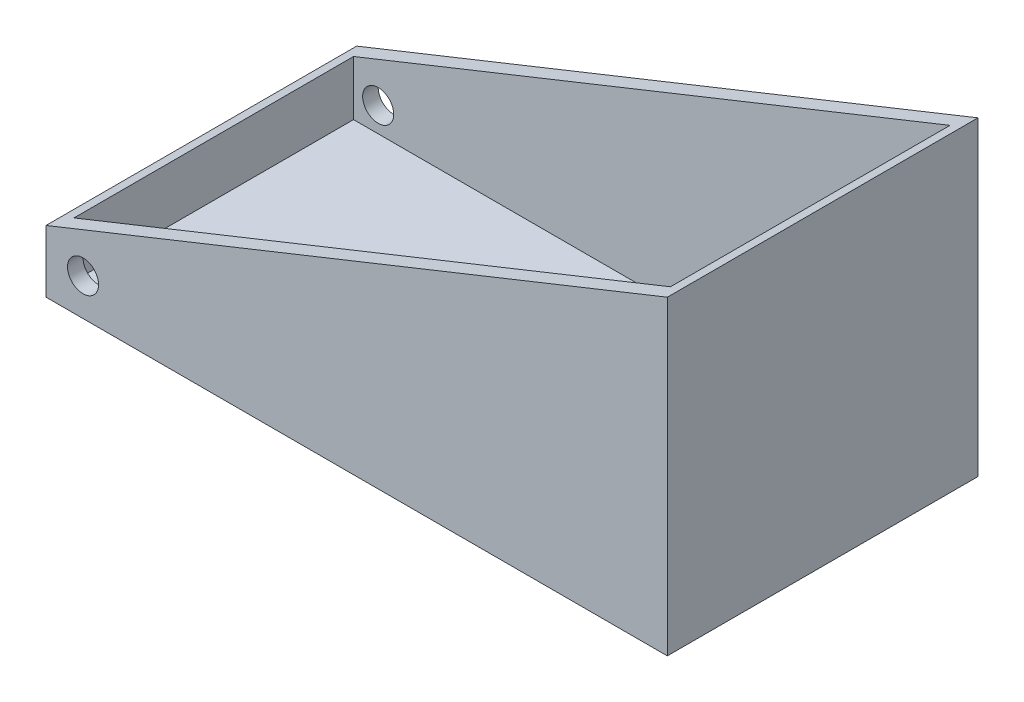
ISO-10303-21;
HEADER;
FILE_DESCRIPTION(('STEP AP214'),'2;1');
FILE_NAME('part.step','',(''),(''),'','','');
FILE_SCHEMA(('AUTOMOTIVE_DESIGN { 1 0 10303 214 1 1 1 1 }'));
ENDSEC;
DATA;
#1=APPLICATION_CONTEXT('core data for automotive mechanical design processes');
#2=APPLICATION_PROTOCOL_DEFINITION('international standard','automotive_design',2000,#1);
#3=PRODUCT_CONTEXT('',#1,'mechanical');
#4=PRODUCT('Part','Part','',(#3));
#5=PRODUCT_RELATED_PRODUCT_CATEGORY('part','',(#4));
#6=PRODUCT_DEFINITION_FORMATION('','',#4);
#7=PRODUCT_DEFINITION_CONTEXT('part definition',#1,'design');
#8=PRODUCT_DEFINITION('design','',#6,#7);
#9=PRODUCT_DEFINITION_SHAPE('','',#8);
#10=(LENGTH_UNIT() NAMED_UNIT(*) SI_UNIT(.MILLI.,.METRE.));
#11=(NAMED_UNIT(*) PLANE_ANGLE_UNIT() SI_UNIT($,.RADIAN.));
#12=(NAMED_UNIT(*) SI_UNIT($,.STERADIAN.) SOLID_ANGLE_UNIT());
#13=UNCERTAINTY_MEASURE_WITH_UNIT(LENGTH_MEASURE(1.E-05),#10,'distance_accuracy_value','');
#14=(GEOMETRIC_REPRESENTATION_CONTEXT(3) GLOBAL_UNCERTAINTY_ASSIGNED_CONTEXT((#13)) GLOBAL_UNIT_ASSIGNED_CONTEXT((#10,
#11,#12)) REPRESENTATION_CONTEXT('',''));
#15=CARTESIAN_POINT('',(0.,0.,0.));
#16=DIRECTION('',(0.,0.,1.));
#17=DIRECTION('',(1.,0.,0.));
#18=AXIS2_PLACEMENT_3D('',#15,#16,#17);
#19=CARTESIAN_POINT('',(100.,-2.4131274131274,50.));
#20=DIRECTION('',(0.,1.,0.));
#21=DIRECTION('',(-1.,0.,0.));
#22=AXIS2_PLACEMENT_3D('',#19,#20,#21);
#23=PLANE('',#22);
#24=DIRECTION('',(1.,0.,0.));
#25=VECTOR('',#24,1.);
#26=CARTESIAN_POINT('',(100.,-2.4131274131274,0.));
#27=LINE('',#26,#25);
#28=CARTESIAN_POINT('',(0.,-2.41312741312741,0.));
#29=VERTEX_POINT('',#28);
#30=CARTESIAN_POINT('',(100.,-2.4131274131274,0.));
#31=VERTEX_POINT('',#30);
#32=EDGE_CURVE('E147',#29,#31,#27,.T.);
#33=ORIENTED_EDGE('',*,*,#32,.T.);
#34=DIRECTION('',(0.,0.,-1.));
#35=VECTOR('',#34,1.);
#36=CARTESIAN_POINT('',(100.,-2.4131274131274,50.));
#37=LINE('',#36,#35);
#38=CARTESIAN_POINT('',(100.,-2.4131274131274,50.));
#39=VERTEX_POINT('',#38);
#40=EDGE_CURVE('E167',#39,#31,#37,.T.);
#41=ORIENTED_EDGE('',*,*,#40,.F.);
#42=DIRECTION('',(1.,0.,0.));
#43=VECTOR('',#42,1.);
#44=CARTESIAN_POINT('',(100.,-2.4131274131274,50.));
#45=LINE('',#44,#43);
#46=CARTESIAN_POINT('',(0.,-2.41312741312741,50.));
#47=VERTEX_POINT('',#46);
#48=EDGE_CURVE('E95',#47,#39,#45,.T.);
#49=ORIENTED_EDGE('',*,*,#48,.F.);
#50=DIRECTION('',(0.,0.,-1.));
#51=VECTOR('',#50,1.);
#52=CARTESIAN_POINT('',(0.,-2.41312741312741,50.));
#53=LINE('',#52,#51);
#54=EDGE_CURVE('E170',#47,#29,#53,.T.);
#55=ORIENTED_EDGE('',*,*,#54,.T.);
#56=EDGE_LOOP('',(#33,#41,#49,#55));
#57=FACE_BOUND('',#56,.T.);
#58=ADVANCED_FACE('F41',(#57),#23,.F.);
#59=CARTESIAN_POINT('',(100.,47.5868725868726,50.));
#60=DIRECTION('',(-1.,0.,0.));
#61=DIRECTION('',(0.,-1.,0.));
#62=AXIS2_PLACEMENT_3D('',#59,#60,#61);
#63=PLANE('',#62);
#64=DIRECTION('',(0.,1.,0.));
#65=VECTOR('',#64,1.);
#66=CARTESIAN_POINT('',(100.,47.5868725868726,0.));
#67=LINE('',#66,#65);
#68=CARTESIAN_POINT('',(100.,47.5868725868726,0.));
#69=VERTEX_POINT('',#68);
#70=EDGE_CURVE('E160',#31,#69,#67,.T.);
#71=ORIENTED_EDGE('',*,*,#70,.T.);
#72=DIRECTION('',(0.,0.,-1.));
#73=VECTOR('',#72,1.);
#74=CARTESIAN_POINT('',(100.,47.5868725868726,50.));
#75=LINE('',#74,#73);
#76=CARTESIAN_POINT('',(100.,47.5868725868726,50.));
#77=VERTEX_POINT('',#76);
#78=EDGE_CURVE('E165',#77,#69,#75,.T.);
#79=ORIENTED_EDGE('',*,*,#78,.F.);
#80=DIRECTION('',(0.,1.,0.));
#81=VECTOR('',#80,1.);
#82=CARTESIAN_POINT('',(100.,47.5868725868726,50.));
#83=LINE('',#82,#81);
#84=EDGE_CURVE('E154',#39,#77,#83,.T.);
#85=ORIENTED_EDGE('',*,*,#84,.F.);
#86=ORIENTED_EDGE('',*,*,#40,.T.);
#87=EDGE_LOOP('',(#71,#79,#85,#86));
#88=FACE_BOUND('',#87,.T.);
#89=ADVANCED_FACE('F197',(#88),#63,.F.);
#90=CARTESIAN_POINT('',(0.,7.58687258687259,50.));
#91=DIRECTION('',(0.371390676354104,-0.928476690885259,0.));
#92=DIRECTION('',(0.928476690885259,0.371390676354104,0.));
#93=AXIS2_PLACEMENT_3D('',#90,#91,#92);
#94=PLANE('',#93);
#95=DIRECTION('',(0.,0.,1.));
#96=VECTOR('',#95,1.);
#97=CARTESIAN_POINT('',(98.,46.7868725868726,50.));
#98=LINE('',#97,#96);
#99=CARTESIAN_POINT('',(98.,46.7868725868726,2.5));
#100=VERTEX_POINT('',#99);
#101=CARTESIAN_POINT('',(98.,46.7868725868726,47.5));
#102=VERTEX_POINT('',#101);
#103=EDGE_CURVE('E49',#100,#102,#98,.T.);
#104=ORIENTED_EDGE('',*,*,#103,.T.);
#105=DIRECTION('',(-0.928476690885259,-0.371390676354104,0.));
#106=VECTOR('',#105,1.);
#107=CARTESIAN_POINT('',(0.,7.58687258687259,47.5));
#108=LINE('',#107,#106);
#109=CARTESIAN_POINT('',(2.,8.38687258687259,47.5));
#110=VERTEX_POINT('',#109);
#111=EDGE_CURVE('E11',#102,#110,#108,.T.);
#112=ORIENTED_EDGE('',*,*,#111,.T.);
#113=DIRECTION('',(0.,0.,-1.));
#114=VECTOR('',#113,1.);
#115=CARTESIAN_POINT('',(2.,8.38687258687259,50.));
#116=LINE('',#115,#114);
#117=CARTESIAN_POINT('',(2.,8.38687258687259,2.5));
#118=VERTEX_POINT('',#117);
#119=EDGE_CURVE('E120',#110,#118,#116,.T.);
#120=ORIENTED_EDGE('',*,*,#119,.T.);
#121=DIRECTION('',(0.928476690885259,0.371390676354104,0.));
#122=VECTOR('',#121,1.);
#123=CARTESIAN_POINT('',(0.,7.58687258687259,2.5));
#124=LINE('',#123,#122);
#125=EDGE_CURVE('E173',#118,#100,#124,.T.);
#126=ORIENTED_EDGE('',*,*,#125,.T.);
#127=EDGE_LOOP('',(#104,#112,#120,#126));
#128=FACE_BOUND('',#127,.T.);
#129=DIRECTION('',(-0.928476690885259,-0.371390676354104,0.));
#130=VECTOR('',#129,1.);
#131=CARTESIAN_POINT('',(0.,7.58687258687259,0.));
#132=LINE('',#131,#130);
#133=CARTESIAN_POINT('',(0.,7.58687258687259,0.));
#134=VERTEX_POINT('',#133);
#135=EDGE_CURVE('E88',#69,#134,#132,.T.);
#136=ORIENTED_EDGE('',*,*,#135,.T.);
#137=DIRECTION('',(0.,0.,-1.));
#138=VECTOR('',#137,1.);
#139=CARTESIAN_POINT('',(0.,7.58687258687259,50.));
#140=LINE('',#139,#138);
#141=CARTESIAN_POINT('',(0.,7.58687258687259,50.));
#142=VERTEX_POINT('',#141);
#143=EDGE_CURVE('E158',#142,#134,#140,.T.);
#144=ORIENTED_EDGE('',*,*,#143,.F.);
#145=DIRECTION('',(-0.928476690885259,-0.371390676354104,0.));
#146=VECTOR('',#145,1.);
#147=CARTESIAN_POINT('',(0.,7.58687258687259,50.));
#148=LINE('',#147,#146);
#149=EDGE_CURVE('E156',#77,#142,#148,.T.);
#150=ORIENTED_EDGE('',*,*,#149,.F.);
#151=ORIENTED_EDGE('',*,*,#78,.T.);
#152=EDGE_LOOP('',(#136,#144,#150,#151));
#153=FACE_BOUND('',#152,.T.);
#154=ADVANCED_FACE('F178',(#128,#153),#94,.F.);
#155=CARTESIAN_POINT('',(0.,0.25096525096525,50.));
#156=DIRECTION('',(1.,0.,0.));
#157=DIRECTION('',(0.,0.,-1.));
#158=AXIS2_PLACEMENT_3D('',#155,#156,#157);
#159=PLANE('',#158);
#160=DIRECTION('',(0.,-1.,0.));
#161=VECTOR('',#160,1.);
#162=CARTESIAN_POINT('',(0.,0.25096525096525,0.));
#163=LINE('',#162,#161);
#164=EDGE_CURVE('E152',#134,#29,#163,.T.);
#165=ORIENTED_EDGE('',*,*,#164,.T.);
#166=ORIENTED_EDGE('',*,*,#54,.F.);
#167=DIRECTION('',(0.,-1.,0.));
#168=VECTOR('',#167,1.);
#169=CARTESIAN_POINT('',(0.,-2.41312741312741,50.));
#170=LINE('',#169,#168);
#171=EDGE_CURVE('E65',#142,#47,#170,.T.);
#172=ORIENTED_EDGE('',*,*,#171,.F.);
#173=ORIENTED_EDGE('',*,*,#143,.T.);
#174=EDGE_LOOP('',(#165,#166,#172,#173));
#175=FACE_BOUND('',#174,.T.);
#176=ADVANCED_FACE('F209',(#175),#159,.F.);
#177=CARTESIAN_POINT('',(0.,0.,50.));
#178=DIRECTION('',(0.,0.,1.));
#179=DIRECTION('',(1.,0.,0.));
#180=AXIS2_PLACEMENT_3D('',#177,#178,#179);
#181=PLANE('',#180);
#182=CARTESIAN_POINT('',(5.96291201783626,3.54978460470885,50.));
#183=DIRECTION('',(0.,0.,-1.));
#184=DIRECTION('',(-1.,0.,0.));
#185=AXIS2_PLACEMENT_3D('',#182,#183,#184);
#186=CIRCLE('',#185,2.5);
#187=CARTESIAN_POINT('',(3.46291201783626,3.54978460470885,50.));
#188=VERTEX_POINT('',#187);
#189=EDGE_CURVE('E275',#188,#188,#186,.T.);
#190=ORIENTED_EDGE('',*,*,#189,.T.);
#191=EDGE_LOOP('',(#190));
#192=FACE_BOUND('',#191,.T.);
#193=ORIENTED_EDGE('',*,*,#171,.T.);
#194=ORIENTED_EDGE('',*,*,#48,.T.);
#195=ORIENTED_EDGE('',*,*,#84,.T.);
#196=ORIENTED_EDGE('',*,*,#149,.T.);
#197=EDGE_LOOP('',(#193,#194,#195,#196));
#198=FACE_BOUND('',#197,.T.);
#199=ADVANCED_FACE('F212',(#192,#198),#181,.T.);
#200=CARTESIAN_POINT('',(0.,0.,0.));
#201=DIRECTION('',(0.,0.,1.));
#202=DIRECTION('',(1.,0.,0.));
#203=AXIS2_PLACEMENT_3D('',#200,#201,#202);
#204=PLANE('',#203);
#205=CARTESIAN_POINT('',(5.96291201783626,3.54978460470885,0.));
#206=DIRECTION('',(0.,0.,-1.));
#207=DIRECTION('',(-1.,0.,0.));
#208=AXIS2_PLACEMENT_3D('',#205,#206,#207);
#209=CIRCLE('',#208,2.5);
#210=CARTESIAN_POINT('',(3.46291201783626,3.54978460470885,0.));
#211=VERTEX_POINT('',#210);
#212=EDGE_CURVE('E315',#211,#211,#209,.T.);
#213=ORIENTED_EDGE('',*,*,#212,.F.);
#214=EDGE_LOOP('',(#213));
#215=FACE_BOUND('',#214,.T.);
#216=ORIENTED_EDGE('',*,*,#32,.F.);
#217=ORIENTED_EDGE('',*,*,#164,.F.);
#218=ORIENTED_EDGE('',*,*,#135,.F.);
#219=ORIENTED_EDGE('',*,*,#70,.F.);
#220=EDGE_LOOP('',(#216,#217,#218,#219));
#221=FACE_BOUND('',#220,.T.);
#222=ADVANCED_FACE('F208',(#215,#221),#204,.F.);
#223=CARTESIAN_POINT('',(1.99999999999999,47.5868725868726,47.5));
#224=DIRECTION('',(0.,0.,1.));
#225=DIRECTION('',(1.,0.,0.));
#226=AXIS2_PLACEMENT_3D('',#223,#224,#225);
#227=PLANE('',#226);
#228=CARTESIAN_POINT('',(5.96291201783626,3.54978460470885,47.5));
#229=DIRECTION('',(0.,0.,1.));
#230=DIRECTION('',(1.,0.,0.));
#231=AXIS2_PLACEMENT_3D('',#228,#229,#230);
#232=CIRCLE('',#231,2.5);
#233=CARTESIAN_POINT('',(8.46291201783626,3.54978460470885,47.5));
#234=VERTEX_POINT('',#233);
#235=EDGE_CURVE('E138',#234,#234,#232,.T.);
#236=ORIENTED_EDGE('',*,*,#235,.T.);
#237=EDGE_LOOP('',(#236));
#238=FACE_BOUND('',#237,.T.);
#239=DIRECTION('',(0.,-1.,0.));
#240=VECTOR('',#239,1.);
#241=CARTESIAN_POINT('',(98.,47.5868725868726,47.5));
#242=LINE('',#241,#240);
#243=CARTESIAN_POINT('',(98.,-0.4131274131274,47.5));
#244=VERTEX_POINT('',#243);
#245=EDGE_CURVE('E137',#102,#244,#242,.T.);
#246=ORIENTED_EDGE('',*,*,#245,.T.);
#247=DIRECTION('',(-1.,0.,0.));
#248=VECTOR('',#247,1.);
#249=CARTESIAN_POINT('',(2.,-0.413127413127412,47.5));
#250=LINE('',#249,#248);
#251=CARTESIAN_POINT('',(2.,-0.413127413127412,47.5));
#252=VERTEX_POINT('',#251);
#253=EDGE_CURVE('E130',#244,#252,#250,.T.);
#254=ORIENTED_EDGE('',*,*,#253,.T.);
#255=DIRECTION('',(0.,-1.,0.));
#256=VECTOR('',#255,1.);
#257=CARTESIAN_POINT('',(1.99999999999999,47.5868725868726,47.5));
#258=LINE('',#257,#256);
#259=EDGE_CURVE('E115',#110,#252,#258,.T.);
#260=ORIENTED_EDGE('',*,*,#259,.F.);
#261=ORIENTED_EDGE('',*,*,#111,.F.);
#262=EDGE_LOOP('',(#246,#254,#260,#261));
#263=FACE_BOUND('',#262,.T.);
#264=ADVANCED_FACE('F135',(#238,#263),#227,.F.);
#265=CARTESIAN_POINT('',(98.,47.5868725868726,47.5));
#266=DIRECTION('',(1.,0.,0.));
#267=DIRECTION('',(0.,0.,-1.));
#268=AXIS2_PLACEMENT_3D('',#265,#266,#267);
#269=PLANE('',#268);
#270=DIRECTION('',(0.,-1.,0.));
#271=VECTOR('',#270,1.);
#272=CARTESIAN_POINT('',(98.,47.5868725868726,2.5));
#273=LINE('',#272,#271);
#274=CARTESIAN_POINT('',(98.,-0.4131274131274,2.5));
#275=VERTEX_POINT('',#274);
#276=EDGE_CURVE('E148',#100,#275,#273,.T.);
#277=ORIENTED_EDGE('',*,*,#276,.T.);
#278=DIRECTION('',(0.,0.,1.));
#279=VECTOR('',#278,1.);
#280=CARTESIAN_POINT('',(98.,-0.4131274131274,47.5));
#281=LINE('',#280,#279);
#282=EDGE_CURVE('E123',#275,#244,#281,.T.);
#283=ORIENTED_EDGE('',*,*,#282,.T.);
#284=ORIENTED_EDGE('',*,*,#245,.F.);
#285=ORIENTED_EDGE('',*,*,#103,.F.);
#286=EDGE_LOOP('',(#277,#283,#284,#285));
#287=FACE_BOUND('',#286,.T.);
#288=ADVANCED_FACE('F181',(#287),#269,.F.);
#289=CARTESIAN_POINT('',(2.,47.5868725868726,2.5));
#290=DIRECTION('',(0.,0.,-1.));
#291=DIRECTION('',(-1.,0.,0.));
#292=AXIS2_PLACEMENT_3D('',#289,#290,#291);
#293=PLANE('',#292);
#294=CARTESIAN_POINT('',(5.96291201783626,3.54978460470885,2.5));
#295=DIRECTION('',(0.,0.,-1.));
#296=DIRECTION('',(-1.,0.,0.));
#297=AXIS2_PLACEMENT_3D('',#294,#295,#296);
#298=CIRCLE('',#297,2.5);
#299=CARTESIAN_POINT('',(3.46291201783626,3.54978460470885,2.5));
#300=VERTEX_POINT('',#299);
#301=EDGE_CURVE('E44',#300,#300,#298,.T.);
#302=ORIENTED_EDGE('',*,*,#301,.T.);
#303=EDGE_LOOP('',(#302));
#304=FACE_BOUND('',#303,.T.);
#305=DIRECTION('',(0.,-1.,0.));
#306=VECTOR('',#305,1.);
#307=CARTESIAN_POINT('',(2.,47.5868725868726,2.5));
#308=LINE('',#307,#306);
#309=CARTESIAN_POINT('',(2.00000000000001,-0.413127413127412,2.5));
#310=VERTEX_POINT('',#309);
#311=EDGE_CURVE('E56',#118,#310,#308,.T.);
#312=ORIENTED_EDGE('',*,*,#311,.T.);
#313=DIRECTION('',(1.,0.,0.));
#314=VECTOR('',#313,1.);
#315=CARTESIAN_POINT('',(2.00000000000001,-0.413127413127412,2.5));
#316=LINE('',#315,#314);
#317=EDGE_CURVE('E133',#310,#275,#316,.T.);
#318=ORIENTED_EDGE('',*,*,#317,.T.);
#319=ORIENTED_EDGE('',*,*,#276,.F.);
#320=ORIENTED_EDGE('',*,*,#125,.F.);
#321=EDGE_LOOP('',(#312,#318,#319,#320));
#322=FACE_BOUND('',#321,.T.);
#323=ADVANCED_FACE('F183',(#304,#322),#293,.F.);
#324=CARTESIAN_POINT('',(1.99999999999999,47.5868725868726,47.5));
#325=DIRECTION('',(-1.,0.,0.));
#326=DIRECTION('',(0.,-1.,0.));
#327=AXIS2_PLACEMENT_3D('',#324,#325,#326);
#328=PLANE('',#327);
#329=ORIENTED_EDGE('',*,*,#259,.T.);
#330=DIRECTION('',(0.,0.,-1.));
#331=VECTOR('',#330,1.);
#332=CARTESIAN_POINT('',(2.,-0.413127413127412,47.5));
#333=LINE('',#332,#331);
#334=EDGE_CURVE('E118',#252,#310,#333,.T.);
#335=ORIENTED_EDGE('',*,*,#334,.T.);
#336=ORIENTED_EDGE('',*,*,#311,.F.);
#337=ORIENTED_EDGE('',*,*,#119,.F.);
#338=EDGE_LOOP('',(#329,#335,#336,#337));
#339=FACE_BOUND('',#338,.T.);
#340=ADVANCED_FACE('F117',(#339),#328,.F.);
#341=CARTESIAN_POINT('',(0.,-0.413127413127413,0.));
#342=DIRECTION('',(0.,1.,0.));
#343=DIRECTION('',(-1.,0.,0.));
#344=AXIS2_PLACEMENT_3D('',#341,#342,#343);
#345=PLANE('',#344);
#346=ORIENTED_EDGE('',*,*,#253,.F.);
#347=ORIENTED_EDGE('',*,*,#282,.F.);
#348=ORIENTED_EDGE('',*,*,#317,.F.);
#349=ORIENTED_EDGE('',*,*,#334,.F.);
#350=EDGE_LOOP('',(#346,#347,#348,#349));
#351=FACE_BOUND('',#350,.T.);
#352=ADVANCED_FACE('F128',(#351),#345,.T.);
#353=CARTESIAN_POINT('',(5.96291201783626,3.54978460470885,50.));
#354=DIRECTION('',(0.,0.,-1.));
#355=DIRECTION('',(-1.,0.,0.));
#356=AXIS2_PLACEMENT_3D('',#353,#354,#355);
#357=CYLINDRICAL_SURFACE('',#356,2.5);
#358=ORIENTED_EDGE('',*,*,#212,.T.);
#359=EDGE_LOOP('',(#358));
#360=FACE_BOUND('',#359,.T.);
#361=ORIENTED_EDGE('',*,*,#301,.F.);
#362=EDGE_LOOP('',(#361));
#363=FACE_BOUND('',#362,.T.);
#364=ADVANCED_FACE('F250',(#360,#363),#357,.F.);
#365=ORIENTED_EDGE('',*,*,#189,.F.);
#366=EDGE_LOOP('',(#365));
#367=FACE_BOUND('',#366,.T.);
#368=ORIENTED_EDGE('',*,*,#235,.F.);
#369=EDGE_LOOP('',(#368));
#370=FACE_BOUND('',#369,.T.);
#371=ADVANCED_FACE('F261',(#367,#370),#357,.F.);
#372=CLOSED_SHELL('',(#58,#89,#154,#176,#199,#222,#264,#288,#323,#340,#352,#364,#371));
#373=MANIFOLD_SOLID_BREP('B2',#372);
#374=ADVANCED_BREP_SHAPE_REPRESENTATION('',(#18,#373),#14);
#375=SHAPE_DEFINITION_REPRESENTATION(#9,#374);
ENDSEC;
END-ISO-10303-21;
